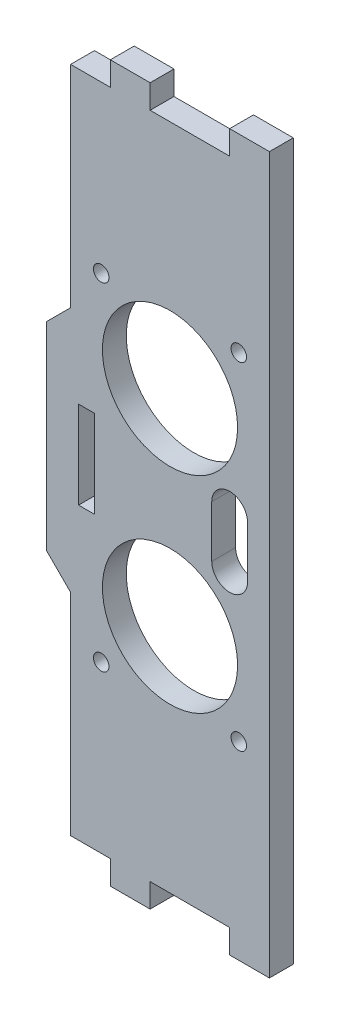
ISO-10303-21;
HEADER;
FILE_DESCRIPTION(('STEP AP214'),'2;1');
FILE_NAME('part.step','',(''),(''),'','','');
FILE_SCHEMA(('AUTOMOTIVE_DESIGN { 1 0 10303 214 1 1 1 1 }'));
ENDSEC;
DATA;
#1=APPLICATION_CONTEXT('core data for automotive mechanical design processes');
#2=APPLICATION_PROTOCOL_DEFINITION('international standard','automotive_design',2000,#1);
#3=PRODUCT_CONTEXT('',#1,'mechanical');
#4=PRODUCT('Part','Part','',(#3));
#5=PRODUCT_RELATED_PRODUCT_CATEGORY('part','',(#4));
#6=PRODUCT_DEFINITION_FORMATION('','',#4);
#7=PRODUCT_DEFINITION_CONTEXT('part definition',#1,'design');
#8=PRODUCT_DEFINITION('design','',#6,#7);
#9=PRODUCT_DEFINITION_SHAPE('','',#8);
#10=(LENGTH_UNIT() NAMED_UNIT(*) SI_UNIT(.MILLI.,.METRE.));
#11=(NAMED_UNIT(*) PLANE_ANGLE_UNIT() SI_UNIT($,.RADIAN.));
#12=(NAMED_UNIT(*) SI_UNIT($,.STERADIAN.) SOLID_ANGLE_UNIT());
#13=UNCERTAINTY_MEASURE_WITH_UNIT(LENGTH_MEASURE(1.E-05),#10,'distance_accuracy_value','');
#14=(GEOMETRIC_REPRESENTATION_CONTEXT(3) GLOBAL_UNCERTAINTY_ASSIGNED_CONTEXT((#13)) GLOBAL_UNIT_ASSIGNED_CONTEXT((#10,
#11,#12)) REPRESENTATION_CONTEXT('',''));
#15=CARTESIAN_POINT('',(0.,0.,0.));
#16=DIRECTION('',(0.,0.,1.));
#17=DIRECTION('',(1.,0.,0.));
#18=AXIS2_PLACEMENT_3D('',#15,#16,#17);
#19=CARTESIAN_POINT('',(-12.5,-45.,3.));
#20=DIRECTION('',(1.,0.,0.));
#21=DIRECTION('',(0.,0.,-1.));
#22=AXIS2_PLACEMENT_3D('',#19,#20,#21);
#23=PLANE('',#22);
#24=DIRECTION('',(0.,-1.,0.));
#25=VECTOR('',#24,1.);
#26=CARTESIAN_POINT('',(-12.5,-45.,0.));
#27=LINE('',#26,#25);
#28=CARTESIAN_POINT('',(-12.5,42.,0.));
#29=VERTEX_POINT('',#28);
#30=CARTESIAN_POINT('',(-12.5,15.5,0.));
#31=VERTEX_POINT('',#30);
#32=EDGE_CURVE('E443',#29,#31,#27,.T.);
#33=ORIENTED_EDGE('',*,*,#32,.T.);
#34=DIRECTION('',(0.,0.,1.));
#35=VECTOR('',#34,1.);
#36=CARTESIAN_POINT('',(-12.5,15.5,3.));
#37=LINE('',#36,#35);
#38=CARTESIAN_POINT('',(-12.5,15.5,3.));
#39=VERTEX_POINT('',#38);
#40=EDGE_CURVE('E57',#31,#39,#37,.T.);
#41=ORIENTED_EDGE('',*,*,#40,.T.);
#42=DIRECTION('',(0.,-1.,0.));
#43=VECTOR('',#42,1.);
#44=CARTESIAN_POINT('',(-12.5,-45.,3.));
#45=LINE('',#44,#43);
#46=CARTESIAN_POINT('',(-12.5,42.,3.));
#47=VERTEX_POINT('',#46);
#48=EDGE_CURVE('E227',#47,#39,#45,.T.);
#49=ORIENTED_EDGE('',*,*,#48,.F.);
#50=DIRECTION('',(0.,0.,-1.));
#51=VECTOR('',#50,1.);
#52=CARTESIAN_POINT('',(-12.5,42.,3.));
#53=LINE('',#52,#51);
#54=EDGE_CURVE('E427',#47,#29,#53,.T.);
#55=ORIENTED_EDGE('',*,*,#54,.T.);
#56=EDGE_LOOP('',(#33,#41,#49,#55));
#57=FACE_BOUND('',#56,.T.);
#58=ADVANCED_FACE('F35',(#57),#23,.F.);
#59=CARTESIAN_POINT('',(0.,0.,3.));
#60=DIRECTION('',(0.,0.,1.));
#61=DIRECTION('',(1.,0.,0.));
#62=AXIS2_PLACEMENT_3D('',#59,#60,#61);
#63=PLANE('',#62);
#64=CARTESIAN_POINT('',(0.,12.95,3.));
#65=DIRECTION('',(0.,0.,1.));
#66=DIRECTION('',(1.,0.,0.));
#67=AXIS2_PLACEMENT_3D('',#64,#65,#66);
#68=CIRCLE('',#67,8.5);
#69=CARTESIAN_POINT('',(8.5,12.95,3.));
#70=VERTEX_POINT('',#69);
#71=EDGE_CURVE('E322',#70,#70,#68,.T.);
#72=ORIENTED_EDGE('',*,*,#71,.F.);
#73=EDGE_LOOP('',(#72));
#74=FACE_BOUND('',#73,.T.);
#75=CARTESIAN_POINT('',(-8.65,-21.175,3.));
#76=DIRECTION('',(0.,0.,1.));
#77=DIRECTION('',(1.,0.,0.));
#78=AXIS2_PLACEMENT_3D('',#75,#76,#77);
#79=CIRCLE('',#78,0.975);
#80=CARTESIAN_POINT('',(-7.675,-21.175,3.));
#81=VERTEX_POINT('',#80);
#82=EDGE_CURVE('E315',#81,#81,#79,.T.);
#83=ORIENTED_EDGE('',*,*,#82,.F.);
#84=EDGE_LOOP('',(#83));
#85=FACE_BOUND('',#84,.T.);
#86=CARTESIAN_POINT('',(8.65,21.175,3.));
#87=DIRECTION('',(0.,0.,1.));
#88=DIRECTION('',(1.,0.,0.));
#89=AXIS2_PLACEMENT_3D('',#86,#87,#88);
#90=CIRCLE('',#89,0.975);
#91=CARTESIAN_POINT('',(9.625,21.175,3.));
#92=VERTEX_POINT('',#91);
#93=EDGE_CURVE('E334',#92,#92,#90,.T.);
#94=ORIENTED_EDGE('',*,*,#93,.F.);
#95=EDGE_LOOP('',(#94));
#96=FACE_BOUND('',#95,.T.);
#97=CARTESIAN_POINT('',(-8.65,21.175,3.));
#98=DIRECTION('',(0.,0.,1.));
#99=DIRECTION('',(1.,0.,0.));
#100=AXIS2_PLACEMENT_3D('',#97,#98,#99);
#101=CIRCLE('',#100,0.975);
#102=CARTESIAN_POINT('',(-7.675,21.175,3.));
#103=VERTEX_POINT('',#102);
#104=EDGE_CURVE('E327',#103,#103,#101,.T.);
#105=ORIENTED_EDGE('',*,*,#104,.F.);
#106=EDGE_LOOP('',(#105));
#107=FACE_BOUND('',#106,.T.);
#108=CARTESIAN_POINT('',(8.65,-21.175,3.));
#109=DIRECTION('',(0.,0.,1.));
#110=DIRECTION('',(1.,0.,0.));
#111=AXIS2_PLACEMENT_3D('',#108,#109,#110);
#112=CIRCLE('',#111,0.975);
#113=CARTESIAN_POINT('',(9.625,-21.175,3.));
#114=VERTEX_POINT('',#113);
#115=EDGE_CURVE('E278',#114,#114,#112,.T.);
#116=ORIENTED_EDGE('',*,*,#115,.F.);
#117=EDGE_LOOP('',(#116));
#118=FACE_BOUND('',#117,.T.);
#119=DIRECTION('',(0.,1.,0.));
#120=VECTOR('',#119,1.);
#121=CARTESIAN_POINT('',(9.75,-3.25,3.));
#122=LINE('',#121,#120);
#123=CARTESIAN_POINT('',(9.75,-3.25,3.));
#124=VERTEX_POINT('',#123);
#125=CARTESIAN_POINT('',(9.75,3.25,3.));
#126=VERTEX_POINT('',#125);
#127=EDGE_CURVE('E288',#124,#126,#122,.T.);
#128=ORIENTED_EDGE('',*,*,#127,.F.);
#129=CARTESIAN_POINT('',(7.5,-3.25,3.));
#130=DIRECTION('',(0.,0.,1.));
#131=DIRECTION('',(1.,0.,0.));
#132=AXIS2_PLACEMENT_3D('',#129,#130,#131);
#133=CIRCLE('',#132,2.25);
#134=CARTESIAN_POINT('',(5.25,-3.25,3.));
#135=VERTEX_POINT('',#134);
#136=EDGE_CURVE('E286',#135,#124,#133,.T.);
#137=ORIENTED_EDGE('',*,*,#136,.F.);
#138=DIRECTION('',(0.,-1.,0.));
#139=VECTOR('',#138,1.);
#140=CARTESIAN_POINT('',(5.25,3.25,3.));
#141=LINE('',#140,#139);
#142=CARTESIAN_POINT('',(5.25,3.25,3.));
#143=VERTEX_POINT('',#142);
#144=EDGE_CURVE('E294',#143,#135,#141,.T.);
#145=ORIENTED_EDGE('',*,*,#144,.F.);
#146=CARTESIAN_POINT('',(7.5,3.25,3.));
#147=DIRECTION('',(0.,0.,1.));
#148=DIRECTION('',(1.,0.,0.));
#149=AXIS2_PLACEMENT_3D('',#146,#147,#148);
#150=CIRCLE('',#149,2.25);
#151=EDGE_CURVE('E291',#126,#143,#150,.T.);
#152=ORIENTED_EDGE('',*,*,#151,.F.);
#153=EDGE_LOOP('',(#128,#137,#145,#152));
#154=FACE_BOUND('',#153,.T.);
#155=CARTESIAN_POINT('',(0.,-12.95,3.));
#156=DIRECTION('',(0.,0.,1.));
#157=DIRECTION('',(1.,0.,0.));
#158=AXIS2_PLACEMENT_3D('',#155,#156,#157);
#159=CIRCLE('',#158,8.5);
#160=CARTESIAN_POINT('',(8.50000000000001,-12.95,3.));
#161=VERTEX_POINT('',#160);
#162=EDGE_CURVE('E339',#161,#161,#159,.T.);
#163=ORIENTED_EDGE('',*,*,#162,.F.);
#164=EDGE_LOOP('',(#163));
#165=FACE_BOUND('',#164,.T.);
#166=DIRECTION('',(0.,-1.,0.));
#167=VECTOR('',#166,1.);
#168=CARTESIAN_POINT('',(7.5,-45.,3.));
#169=LINE('',#168,#167);
#170=CARTESIAN_POINT('',(7.5,-42.,3.));
#171=VERTEX_POINT('',#170);
#172=CARTESIAN_POINT('',(7.5,-45.,3.));
#173=VERTEX_POINT('',#172);
#174=EDGE_CURVE('E345',#171,#173,#169,.T.);
#175=ORIENTED_EDGE('',*,*,#174,.T.);
#176=DIRECTION('',(1.,0.,0.));
#177=VECTOR('',#176,1.);
#178=CARTESIAN_POINT('',(12.5,-45.,3.));
#179=LINE('',#178,#177);
#180=CARTESIAN_POINT('',(12.5,-45.,3.));
#181=VERTEX_POINT('',#180);
#182=EDGE_CURVE('E432',#173,#181,#179,.T.);
#183=ORIENTED_EDGE('',*,*,#182,.T.);
#184=DIRECTION('',(0.,1.,0.));
#185=VECTOR('',#184,1.);
#186=CARTESIAN_POINT('',(12.5,-45.,3.));
#187=LINE('',#186,#185);
#188=CARTESIAN_POINT('',(12.5,45.,3.));
#189=VERTEX_POINT('',#188);
#190=EDGE_CURVE('E436',#181,#189,#187,.T.);
#191=ORIENTED_EDGE('',*,*,#190,.T.);
#192=DIRECTION('',(-1.,0.,0.));
#193=VECTOR('',#192,1.);
#194=CARTESIAN_POINT('',(12.5,45.,3.));
#195=LINE('',#194,#193);
#196=CARTESIAN_POINT('',(7.5,45.,3.));
#197=VERTEX_POINT('',#196);
#198=EDGE_CURVE('E439',#189,#197,#195,.T.);
#199=ORIENTED_EDGE('',*,*,#198,.T.);
#200=DIRECTION('',(0.,1.,0.));
#201=VECTOR('',#200,1.);
#202=CARTESIAN_POINT('',(7.5,45.,3.));
#203=LINE('',#202,#201);
#204=CARTESIAN_POINT('',(7.5,42.,3.));
#205=VERTEX_POINT('',#204);
#206=EDGE_CURVE('E394',#205,#197,#203,.T.);
#207=ORIENTED_EDGE('',*,*,#206,.F.);
#208=DIRECTION('',(1.,0.,0.));
#209=VECTOR('',#208,1.);
#210=CARTESIAN_POINT('',(-2.5,42.,3.));
#211=LINE('',#210,#209);
#212=CARTESIAN_POINT('',(-2.5,42.,3.));
#213=VERTEX_POINT('',#212);
#214=EDGE_CURVE('E391',#213,#205,#211,.T.);
#215=ORIENTED_EDGE('',*,*,#214,.F.);
#216=DIRECTION('',(0.,-1.,0.));
#217=VECTOR('',#216,1.);
#218=CARTESIAN_POINT('',(-2.5,45.,3.));
#219=LINE('',#218,#217);
#220=CARTESIAN_POINT('',(-2.5,45.,3.));
#221=VERTEX_POINT('',#220);
#222=EDGE_CURVE('E389',#221,#213,#219,.T.);
#223=ORIENTED_EDGE('',*,*,#222,.F.);
#224=CARTESIAN_POINT('',(-7.5,45.,3.));
#225=VERTEX_POINT('',#224);
#226=EDGE_CURVE('E438',#221,#225,#195,.T.);
#227=ORIENTED_EDGE('',*,*,#226,.T.);
#228=DIRECTION('',(0.,1.,0.));
#229=VECTOR('',#228,1.);
#230=CARTESIAN_POINT('',(-7.5,45.,3.));
#231=LINE('',#230,#229);
#232=CARTESIAN_POINT('',(-7.5,42.,3.));
#233=VERTEX_POINT('',#232);
#234=EDGE_CURVE('E415',#233,#225,#231,.T.);
#235=ORIENTED_EDGE('',*,*,#234,.F.);
#236=DIRECTION('',(1.,0.,0.));
#237=VECTOR('',#236,1.);
#238=CARTESIAN_POINT('',(-12.5,42.,3.));
#239=LINE('',#238,#237);
#240=EDGE_CURVE('E417',#47,#233,#239,.T.);
#241=ORIENTED_EDGE('',*,*,#240,.F.);
#242=ORIENTED_EDGE('',*,*,#48,.T.);
#243=DIRECTION('',(0.707106781186551,0.707106781186544,0.));
#244=VECTOR('',#243,1.);
#245=CARTESIAN_POINT('',(-15.5,12.5,3.));
#246=LINE('',#245,#244);
#247=CARTESIAN_POINT('',(-15.5,12.5,3.));
#248=VERTEX_POINT('',#247);
#249=EDGE_CURVE('E11',#39,#248,#246,.F.);
#250=ORIENTED_EDGE('',*,*,#249,.T.);
#251=DIRECTION('',(0.,-1.,0.));
#252=VECTOR('',#251,1.);
#253=CARTESIAN_POINT('',(-15.5,12.5,3.));
#254=LINE('',#253,#252);
#255=CARTESIAN_POINT('',(-15.5,-12.5,3.));
#256=VERTEX_POINT('',#255);
#257=EDGE_CURVE('E224',#248,#256,#254,.T.);
#258=ORIENTED_EDGE('',*,*,#257,.T.);
#259=DIRECTION('',(-0.707106781186546,0.707106781186549,0.));
#260=VECTOR('',#259,1.);
#261=CARTESIAN_POINT('',(-12.5,-15.5,3.));
#262=LINE('',#261,#260);
#263=CARTESIAN_POINT('',(-12.5,-15.5,3.));
#264=VERTEX_POINT('',#263);
#265=EDGE_CURVE('E465',#256,#264,#262,.F.);
#266=ORIENTED_EDGE('',*,*,#265,.T.);
#267=CARTESIAN_POINT('',(-12.5,-42.,3.));
#268=VERTEX_POINT('',#267);
#269=EDGE_CURVE('E433',#264,#268,#45,.T.);
#270=ORIENTED_EDGE('',*,*,#269,.T.);
#271=DIRECTION('',(1.,0.,0.));
#272=VECTOR('',#271,1.);
#273=CARTESIAN_POINT('',(-12.5,-42.,3.));
#274=LINE('',#273,#272);
#275=CARTESIAN_POINT('',(-7.5,-42.,3.));
#276=VERTEX_POINT('',#275);
#277=EDGE_CURVE('E375',#268,#276,#274,.T.);
#278=ORIENTED_EDGE('',*,*,#277,.T.);
#279=DIRECTION('',(0.,-1.,0.));
#280=VECTOR('',#279,1.);
#281=CARTESIAN_POINT('',(-7.5,-45.,3.));
#282=LINE('',#281,#280);
#283=CARTESIAN_POINT('',(-7.5,-45.,3.));
#284=VERTEX_POINT('',#283);
#285=EDGE_CURVE('E372',#276,#284,#282,.T.);
#286=ORIENTED_EDGE('',*,*,#285,.T.);
#287=CARTESIAN_POINT('',(-2.5,-45.,3.));
#288=VERTEX_POINT('',#287);
#289=EDGE_CURVE('E435',#284,#288,#179,.T.);
#290=ORIENTED_EDGE('',*,*,#289,.T.);
#291=DIRECTION('',(0.,1.,0.));
#292=VECTOR('',#291,1.);
#293=CARTESIAN_POINT('',(-2.5,-45.,3.));
#294=LINE('',#293,#292);
#295=CARTESIAN_POINT('',(-2.5,-42.,3.));
#296=VERTEX_POINT('',#295);
#297=EDGE_CURVE('E351',#288,#296,#294,.T.);
#298=ORIENTED_EDGE('',*,*,#297,.T.);
#299=DIRECTION('',(1.,0.,0.));
#300=VECTOR('',#299,1.);
#301=CARTESIAN_POINT('',(-2.5,-42.,3.));
#302=LINE('',#301,#300);
#303=EDGE_CURVE('E347',#296,#171,#302,.T.);
#304=ORIENTED_EDGE('',*,*,#303,.T.);
#305=EDGE_LOOP('',(#175,#183,#191,#199,#207,#215,#223,#227,#235,#241,#242,#250,#258,#266,#270,
#278,#286,#290,#298,#304));
#306=FACE_BOUND('',#305,.T.);
#307=DIRECTION('',(1.,0.,0.));
#308=VECTOR('',#307,1.);
#309=CARTESIAN_POINT('',(0.,5.50000000000001,3.));
#310=LINE('',#309,#308);
#311=CARTESIAN_POINT('',(-11.5,5.50000000000001,3.));
#312=VERTEX_POINT('',#311);
#313=CARTESIAN_POINT('',(-9.5,5.50000000000001,3.));
#314=VERTEX_POINT('',#313);
#315=EDGE_CURVE('E271',#312,#314,#310,.T.);
#316=ORIENTED_EDGE('',*,*,#315,.T.);
#317=DIRECTION('',(0.,-1.,0.));
#318=VECTOR('',#317,1.);
#319=CARTESIAN_POINT('',(-9.5,0.,3.));
#320=LINE('',#319,#318);
#321=CARTESIAN_POINT('',(-9.5,-5.49999999999999,3.));
#322=VERTEX_POINT('',#321);
#323=EDGE_CURVE('E274',#314,#322,#320,.T.);
#324=ORIENTED_EDGE('',*,*,#323,.T.);
#325=DIRECTION('',(-1.,0.,0.));
#326=VECTOR('',#325,1.);
#327=CARTESIAN_POINT('',(0.,-5.49999999999999,3.));
#328=LINE('',#327,#326);
#329=CARTESIAN_POINT('',(-11.5,-5.49999999999999,3.));
#330=VERTEX_POINT('',#329);
#331=EDGE_CURVE('E265',#322,#330,#328,.T.);
#332=ORIENTED_EDGE('',*,*,#331,.T.);
#333=DIRECTION('',(0.,1.,0.));
#334=VECTOR('',#333,1.);
#335=CARTESIAN_POINT('',(-11.5,0.,3.));
#336=LINE('',#335,#334);
#337=EDGE_CURVE('E268',#330,#312,#336,.T.);
#338=ORIENTED_EDGE('',*,*,#337,.T.);
#339=EDGE_LOOP('',(#316,#324,#332,#338));
#340=FACE_BOUND('',#339,.T.);
#341=ADVANCED_FACE('F222',(#74,#85,#96,#107,#118,#154,#165,#306,#340),#63,.T.);
#342=CARTESIAN_POINT('',(0.,0.,0.));
#343=DIRECTION('',(0.,0.,1.));
#344=DIRECTION('',(1.,0.,0.));
#345=AXIS2_PLACEMENT_3D('',#342,#343,#344);
#346=PLANE('',#345);
#347=DIRECTION('',(1.,0.,0.));
#348=VECTOR('',#347,1.);
#349=CARTESIAN_POINT('',(12.5,-45.,0.));
#350=LINE('',#349,#348);
#351=CARTESIAN_POINT('',(7.5,-45.,0.));
#352=VERTEX_POINT('',#351);
#353=CARTESIAN_POINT('',(12.5,-45.,0.));
#354=VERTEX_POINT('',#353);
#355=EDGE_CURVE('E445',#352,#354,#350,.T.);
#356=ORIENTED_EDGE('',*,*,#355,.F.);
#357=DIRECTION('',(0.,-1.,0.));
#358=VECTOR('',#357,1.);
#359=CARTESIAN_POINT('',(7.5,-45.,0.));
#360=LINE('',#359,#358);
#361=CARTESIAN_POINT('',(7.5,-42.,0.));
#362=VERTEX_POINT('',#361);
#363=EDGE_CURVE('E355',#362,#352,#360,.T.);
#364=ORIENTED_EDGE('',*,*,#363,.F.);
#365=DIRECTION('',(1.,0.,0.));
#366=VECTOR('',#365,1.);
#367=CARTESIAN_POINT('',(-2.5,-42.,0.));
#368=LINE('',#367,#366);
#369=CARTESIAN_POINT('',(-2.5,-42.,0.));
#370=VERTEX_POINT('',#369);
#371=EDGE_CURVE('E357',#370,#362,#368,.T.);
#372=ORIENTED_EDGE('',*,*,#371,.F.);
#373=DIRECTION('',(0.,1.,0.));
#374=VECTOR('',#373,1.);
#375=CARTESIAN_POINT('',(-2.5,-45.,0.));
#376=LINE('',#375,#374);
#377=CARTESIAN_POINT('',(-2.5,-45.,0.));
#378=VERTEX_POINT('',#377);
#379=EDGE_CURVE('E348',#378,#370,#376,.T.);
#380=ORIENTED_EDGE('',*,*,#379,.F.);
#381=CARTESIAN_POINT('',(-7.5,-45.,0.));
#382=VERTEX_POINT('',#381);
#383=EDGE_CURVE('E447',#382,#378,#350,.T.);
#384=ORIENTED_EDGE('',*,*,#383,.F.);
#385=DIRECTION('',(0.,-1.,0.));
#386=VECTOR('',#385,1.);
#387=CARTESIAN_POINT('',(-7.5,-45.,0.));
#388=LINE('',#387,#386);
#389=CARTESIAN_POINT('',(-7.5,-42.,0.));
#390=VERTEX_POINT('',#389);
#391=EDGE_CURVE('E342',#390,#382,#388,.T.);
#392=ORIENTED_EDGE('',*,*,#391,.F.);
#393=DIRECTION('',(1.,0.,0.));
#394=VECTOR('',#393,1.);
#395=CARTESIAN_POINT('',(-12.5,-42.,0.));
#396=LINE('',#395,#394);
#397=CARTESIAN_POINT('',(-12.5,-42.,0.));
#398=VERTEX_POINT('',#397);
#399=EDGE_CURVE('E376',#398,#390,#396,.T.);
#400=ORIENTED_EDGE('',*,*,#399,.F.);
#401=CARTESIAN_POINT('',(-12.5,-15.5,0.));
#402=VERTEX_POINT('',#401);
#403=EDGE_CURVE('E414',#402,#398,#27,.T.);
#404=ORIENTED_EDGE('',*,*,#403,.F.);
#405=DIRECTION('',(0.707106781186546,-0.707106781186549,0.));
#406=VECTOR('',#405,1.);
#407=CARTESIAN_POINT('',(-14.,-14.,0.));
#408=LINE('',#407,#406);
#409=CARTESIAN_POINT('',(-15.5,-12.5,0.));
#410=VERTEX_POINT('',#409);
#411=EDGE_CURVE('E463',#402,#410,#408,.F.);
#412=ORIENTED_EDGE('',*,*,#411,.T.);
#413=DIRECTION('',(0.,-1.,0.));
#414=VECTOR('',#413,1.);
#415=CARTESIAN_POINT('',(-15.5,12.5,0.));
#416=LINE('',#415,#414);
#417=CARTESIAN_POINT('',(-15.5,12.5,0.));
#418=VERTEX_POINT('',#417);
#419=EDGE_CURVE('E238',#418,#410,#416,.T.);
#420=ORIENTED_EDGE('',*,*,#419,.F.);
#421=DIRECTION('',(-0.707106781186551,-0.707106781186544,0.));
#422=VECTOR('',#421,1.);
#423=CARTESIAN_POINT('',(-13.9999999999999,14.0000000000001,0.));
#424=LINE('',#423,#422);
#425=EDGE_CURVE('E44',#418,#31,#424,.F.);
#426=ORIENTED_EDGE('',*,*,#425,.T.);
#427=ORIENTED_EDGE('',*,*,#32,.F.);
#428=DIRECTION('',(1.,0.,0.));
#429=VECTOR('',#428,1.);
#430=CARTESIAN_POINT('',(-12.5,42.,0.));
#431=LINE('',#430,#429);
#432=CARTESIAN_POINT('',(-7.5,42.,0.));
#433=VERTEX_POINT('',#432);
#434=EDGE_CURVE('E418',#29,#433,#431,.T.);
#435=ORIENTED_EDGE('',*,*,#434,.T.);
#436=DIRECTION('',(0.,1.,0.));
#437=VECTOR('',#436,1.);
#438=CARTESIAN_POINT('',(-7.5,45.,0.));
#439=LINE('',#438,#437);
#440=CARTESIAN_POINT('',(-7.5,45.,0.));
#441=VERTEX_POINT('',#440);
#442=EDGE_CURVE('E371',#433,#441,#439,.T.);
#443=ORIENTED_EDGE('',*,*,#442,.T.);
#444=DIRECTION('',(-1.,0.,0.));
#445=VECTOR('',#444,1.);
#446=CARTESIAN_POINT('',(12.5,45.,0.));
#447=LINE('',#446,#445);
#448=CARTESIAN_POINT('',(-2.5,45.,0.));
#449=VERTEX_POINT('',#448);
#450=EDGE_CURVE('E450',#449,#441,#447,.T.);
#451=ORIENTED_EDGE('',*,*,#450,.F.);
#452=DIRECTION('',(0.,-1.,0.));
#453=VECTOR('',#452,1.);
#454=CARTESIAN_POINT('',(-2.5,45.,0.));
#455=LINE('',#454,#453);
#456=CARTESIAN_POINT('',(-2.5,42.,0.));
#457=VERTEX_POINT('',#456);
#458=EDGE_CURVE('E397',#449,#457,#455,.T.);
#459=ORIENTED_EDGE('',*,*,#458,.T.);
#460=DIRECTION('',(1.,0.,0.));
#461=VECTOR('',#460,1.);
#462=CARTESIAN_POINT('',(-2.5,42.,0.));
#463=LINE('',#462,#461);
#464=CARTESIAN_POINT('',(7.5,42.,0.));
#465=VERTEX_POINT('',#464);
#466=EDGE_CURVE('E400',#457,#465,#463,.T.);
#467=ORIENTED_EDGE('',*,*,#466,.T.);
#468=DIRECTION('',(0.,1.,0.));
#469=VECTOR('',#468,1.);
#470=CARTESIAN_POINT('',(7.5,45.,0.));
#471=LINE('',#470,#469);
#472=CARTESIAN_POINT('',(7.5,45.,0.));
#473=VERTEX_POINT('',#472);
#474=EDGE_CURVE('E392',#465,#473,#471,.T.);
#475=ORIENTED_EDGE('',*,*,#474,.T.);
#476=CARTESIAN_POINT('',(12.5,45.,0.));
#477=VERTEX_POINT('',#476);
#478=EDGE_CURVE('E451',#477,#473,#447,.T.);
#479=ORIENTED_EDGE('',*,*,#478,.F.);
#480=DIRECTION('',(0.,1.,0.));
#481=VECTOR('',#480,1.);
#482=CARTESIAN_POINT('',(12.5,-45.,0.));
#483=LINE('',#482,#481);
#484=EDGE_CURVE('E448',#354,#477,#483,.T.);
#485=ORIENTED_EDGE('',*,*,#484,.F.);
#486=EDGE_LOOP('',(#356,#364,#372,#380,#384,#392,#400,#404,#412,#420,#426,#427,#435,#443,#451,
#459,#467,#475,#479,#485));
#487=FACE_BOUND('',#486,.T.);
#488=CARTESIAN_POINT('',(0.,-12.95,0.));
#489=DIRECTION('',(0.,0.,1.));
#490=DIRECTION('',(1.,0.,0.));
#491=AXIS2_PLACEMENT_3D('',#488,#489,#490);
#492=CIRCLE('',#491,8.5);
#493=CARTESIAN_POINT('',(8.50000000000001,-12.95,0.));
#494=VERTEX_POINT('',#493);
#495=EDGE_CURVE('E330',#494,#494,#492,.T.);
#496=ORIENTED_EDGE('',*,*,#495,.T.);
#497=EDGE_LOOP('',(#496));
#498=FACE_BOUND('',#497,.T.);
#499=CARTESIAN_POINT('',(7.5,-3.25,0.));
#500=DIRECTION('',(0.,0.,1.));
#501=DIRECTION('',(1.,0.,0.));
#502=AXIS2_PLACEMENT_3D('',#499,#500,#501);
#503=CIRCLE('',#502,2.25);
#504=CARTESIAN_POINT('',(5.25,-3.25,0.));
#505=VERTEX_POINT('',#504);
#506=CARTESIAN_POINT('',(9.75,-3.25,0.));
#507=VERTEX_POINT('',#506);
#508=EDGE_CURVE('E277',#505,#507,#503,.T.);
#509=ORIENTED_EDGE('',*,*,#508,.T.);
#510=DIRECTION('',(0.,1.,0.));
#511=VECTOR('',#510,1.);
#512=CARTESIAN_POINT('',(9.75,-3.25,0.));
#513=LINE('',#512,#511);
#514=CARTESIAN_POINT('',(9.75,3.25,0.));
#515=VERTEX_POINT('',#514);
#516=EDGE_CURVE('E299',#507,#515,#513,.T.);
#517=ORIENTED_EDGE('',*,*,#516,.T.);
#518=CARTESIAN_POINT('',(7.5,3.25,0.));
#519=DIRECTION('',(0.,0.,1.));
#520=DIRECTION('',(1.,0.,0.));
#521=AXIS2_PLACEMENT_3D('',#518,#519,#520);
#522=CIRCLE('',#521,2.25);
#523=CARTESIAN_POINT('',(5.25,3.25,0.));
#524=VERTEX_POINT('',#523);
#525=EDGE_CURVE('E302',#515,#524,#522,.T.);
#526=ORIENTED_EDGE('',*,*,#525,.T.);
#527=DIRECTION('',(0.,-1.,0.));
#528=VECTOR('',#527,1.);
#529=CARTESIAN_POINT('',(5.25,3.25,0.));
#530=LINE('',#529,#528);
#531=EDGE_CURVE('E289',#524,#505,#530,.T.);
#532=ORIENTED_EDGE('',*,*,#531,.T.);
#533=EDGE_LOOP('',(#509,#517,#526,#532));
#534=FACE_BOUND('',#533,.T.);
#535=CARTESIAN_POINT('',(8.65,-21.175,0.));
#536=DIRECTION('',(0.,0.,1.));
#537=DIRECTION('',(1.,0.,0.));
#538=AXIS2_PLACEMENT_3D('',#535,#536,#537);
#539=CIRCLE('',#538,0.975);
#540=CARTESIAN_POINT('',(9.625,-21.175,0.));
#541=VERTEX_POINT('',#540);
#542=EDGE_CURVE('E282',#541,#541,#539,.T.);
#543=ORIENTED_EDGE('',*,*,#542,.T.);
#544=EDGE_LOOP('',(#543));
#545=FACE_BOUND('',#544,.T.);
#546=CARTESIAN_POINT('',(-8.65,21.175,0.));
#547=DIRECTION('',(0.,0.,1.));
#548=DIRECTION('',(1.,0.,0.));
#549=AXIS2_PLACEMENT_3D('',#546,#547,#548);
#550=CIRCLE('',#549,0.975);
#551=CARTESIAN_POINT('',(-7.675,21.175,0.));
#552=VERTEX_POINT('',#551);
#553=EDGE_CURVE('E331',#552,#552,#550,.T.);
#554=ORIENTED_EDGE('',*,*,#553,.T.);
#555=EDGE_LOOP('',(#554));
#556=FACE_BOUND('',#555,.T.);
#557=CARTESIAN_POINT('',(8.65,21.175,0.));
#558=DIRECTION('',(0.,0.,1.));
#559=DIRECTION('',(1.,0.,0.));
#560=AXIS2_PLACEMENT_3D('',#557,#558,#559);
#561=CIRCLE('',#560,0.975);
#562=CARTESIAN_POINT('',(9.625,21.175,0.));
#563=VERTEX_POINT('',#562);
#564=EDGE_CURVE('E318',#563,#563,#561,.T.);
#565=ORIENTED_EDGE('',*,*,#564,.T.);
#566=EDGE_LOOP('',(#565));
#567=FACE_BOUND('',#566,.T.);
#568=CARTESIAN_POINT('',(-8.65,-21.175,0.));
#569=DIRECTION('',(0.,0.,1.));
#570=DIRECTION('',(1.,0.,0.));
#571=AXIS2_PLACEMENT_3D('',#568,#569,#570);
#572=CIRCLE('',#571,0.975);
#573=CARTESIAN_POINT('',(-7.675,-21.175,0.));
#574=VERTEX_POINT('',#573);
#575=EDGE_CURVE('E319',#574,#574,#572,.T.);
#576=ORIENTED_EDGE('',*,*,#575,.T.);
#577=EDGE_LOOP('',(#576));
#578=FACE_BOUND('',#577,.T.);
#579=CARTESIAN_POINT('',(0.,12.95,0.));
#580=DIRECTION('',(0.,0.,1.));
#581=DIRECTION('',(1.,0.,0.));
#582=AXIS2_PLACEMENT_3D('',#579,#580,#581);
#583=CIRCLE('',#582,8.5);
#584=CARTESIAN_POINT('',(8.5,12.95,0.));
#585=VERTEX_POINT('',#584);
#586=EDGE_CURVE('E281',#585,#585,#583,.T.);
#587=ORIENTED_EDGE('',*,*,#586,.T.);
#588=EDGE_LOOP('',(#587));
#589=FACE_BOUND('',#588,.T.);
#590=DIRECTION('',(0.,1.,0.));
#591=VECTOR('',#590,1.);
#592=CARTESIAN_POINT('',(-9.5,-5.49999999999999,0.));
#593=LINE('',#592,#591);
#594=CARTESIAN_POINT('',(-9.5,-5.49999999999999,0.));
#595=VERTEX_POINT('',#594);
#596=CARTESIAN_POINT('',(-9.5,5.50000000000001,0.));
#597=VERTEX_POINT('',#596);
#598=EDGE_CURVE('E240',#595,#597,#593,.T.);
#599=ORIENTED_EDGE('',*,*,#598,.T.);
#600=DIRECTION('',(-1.,0.,0.));
#601=VECTOR('',#600,1.);
#602=CARTESIAN_POINT('',(-11.5,5.50000000000001,0.));
#603=LINE('',#602,#601);
#604=CARTESIAN_POINT('',(-11.5,5.50000000000001,0.));
#605=VERTEX_POINT('',#604);
#606=EDGE_CURVE('E243',#597,#605,#603,.T.);
#607=ORIENTED_EDGE('',*,*,#606,.T.);
#608=DIRECTION('',(0.,-1.,0.));
#609=VECTOR('',#608,1.);
#610=CARTESIAN_POINT('',(-11.5,-5.49999999999999,0.));
#611=LINE('',#610,#609);
#612=CARTESIAN_POINT('',(-11.5,-5.49999999999999,0.));
#613=VERTEX_POINT('',#612);
#614=EDGE_CURVE('E250',#605,#613,#611,.T.);
#615=ORIENTED_EDGE('',*,*,#614,.T.);
#616=DIRECTION('',(1.,0.,0.));
#617=VECTOR('',#616,1.);
#618=CARTESIAN_POINT('',(-11.5,-5.49999999999999,0.));
#619=LINE('',#618,#617);
#620=EDGE_CURVE('E253',#613,#595,#619,.T.);
#621=ORIENTED_EDGE('',*,*,#620,.T.);
#622=EDGE_LOOP('',(#599,#607,#615,#621));
#623=FACE_BOUND('',#622,.T.);
#624=ADVANCED_FACE('F476',(#487,#498,#534,#545,#556,#567,#578,#589,#623),#346,.F.);
#625=CARTESIAN_POINT('',(12.5,-45.,3.));
#626=DIRECTION('',(0.,1.,0.));
#627=DIRECTION('',(0.,0.,1.));
#628=AXIS2_PLACEMENT_3D('',#625,#626,#627);
#629=PLANE('',#628);
#630=ORIENTED_EDGE('',*,*,#182,.F.);
#631=DIRECTION('',(0.,0.,-1.));
#632=VECTOR('',#631,1.);
#633=CARTESIAN_POINT('',(7.5,-45.,3.));
#634=LINE('',#633,#632);
#635=EDGE_CURVE('E368',#173,#352,#634,.T.);
#636=ORIENTED_EDGE('',*,*,#635,.T.);
#637=ORIENTED_EDGE('',*,*,#355,.T.);
#638=DIRECTION('',(0.,0.,-1.));
#639=VECTOR('',#638,1.);
#640=CARTESIAN_POINT('',(12.5,-45.,3.));
#641=LINE('',#640,#639);
#642=EDGE_CURVE('E456',#181,#354,#641,.T.);
#643=ORIENTED_EDGE('',*,*,#642,.F.);
#644=EDGE_LOOP('',(#630,#636,#637,#643));
#645=FACE_BOUND('',#644,.T.);
#646=ADVANCED_FACE('F504',(#645),#629,.F.);
#647=ORIENTED_EDGE('',*,*,#269,.F.);
#648=DIRECTION('',(0.,0.,-1.));
#649=VECTOR('',#648,1.);
#650=CARTESIAN_POINT('',(-12.5,-15.5,0.));
#651=LINE('',#650,#649);
#652=EDGE_CURVE('E459',#264,#402,#651,.T.);
#653=ORIENTED_EDGE('',*,*,#652,.T.);
#654=ORIENTED_EDGE('',*,*,#403,.T.);
#655=DIRECTION('',(0.,0.,-1.));
#656=VECTOR('',#655,1.);
#657=CARTESIAN_POINT('',(-12.5,-42.,3.));
#658=LINE('',#657,#656);
#659=EDGE_CURVE('E385',#268,#398,#658,.T.);
#660=ORIENTED_EDGE('',*,*,#659,.F.);
#661=EDGE_LOOP('',(#647,#653,#654,#660));
#662=FACE_BOUND('',#661,.T.);
#663=ADVANCED_FACE('F472',(#662),#23,.F.);
#664=CARTESIAN_POINT('',(12.5,45.,3.));
#665=DIRECTION('',(0.,-1.,0.));
#666=DIRECTION('',(0.,0.,-1.));
#667=AXIS2_PLACEMENT_3D('',#664,#665,#666);
#668=PLANE('',#667);
#669=DIRECTION('',(0.,0.,-1.));
#670=VECTOR('',#669,1.);
#671=CARTESIAN_POINT('',(-2.5,45.,3.));
#672=LINE('',#671,#670);
#673=EDGE_CURVE('E411',#221,#449,#672,.T.);
#674=ORIENTED_EDGE('',*,*,#673,.T.);
#675=ORIENTED_EDGE('',*,*,#450,.T.);
#676=DIRECTION('',(0.,0.,-1.));
#677=VECTOR('',#676,1.);
#678=CARTESIAN_POINT('',(-7.5,45.,3.));
#679=LINE('',#678,#677);
#680=EDGE_CURVE('E401',#225,#441,#679,.T.);
#681=ORIENTED_EDGE('',*,*,#680,.F.);
#682=ORIENTED_EDGE('',*,*,#226,.F.);
#683=EDGE_LOOP('',(#674,#675,#681,#682));
#684=FACE_BOUND('',#683,.T.);
#685=ADVANCED_FACE('F533',(#684),#668,.F.);
#686=DIRECTION('',(0.,0.,-1.));
#687=VECTOR('',#686,1.);
#688=CARTESIAN_POINT('',(7.5,45.,3.));
#689=LINE('',#688,#687);
#690=EDGE_CURVE('E396',#197,#473,#689,.T.);
#691=ORIENTED_EDGE('',*,*,#690,.F.);
#692=ORIENTED_EDGE('',*,*,#198,.F.);
#693=DIRECTION('',(0.,0.,-1.));
#694=VECTOR('',#693,1.);
#695=CARTESIAN_POINT('',(12.5,45.,3.));
#696=LINE('',#695,#694);
#697=EDGE_CURVE('E442',#189,#477,#696,.T.);
#698=ORIENTED_EDGE('',*,*,#697,.T.);
#699=ORIENTED_EDGE('',*,*,#478,.T.);
#700=EDGE_LOOP('',(#691,#692,#698,#699));
#701=FACE_BOUND('',#700,.T.);
#702=ADVANCED_FACE('F515',(#701),#668,.F.);
#703=ORIENTED_EDGE('',*,*,#383,.T.);
#704=DIRECTION('',(0.,0.,-1.));
#705=VECTOR('',#704,1.);
#706=CARTESIAN_POINT('',(-2.5,-45.,3.));
#707=LINE('',#706,#705);
#708=EDGE_CURVE('E354',#288,#378,#707,.T.);
#709=ORIENTED_EDGE('',*,*,#708,.F.);
#710=ORIENTED_EDGE('',*,*,#289,.F.);
#711=DIRECTION('',(0.,0.,-1.));
#712=VECTOR('',#711,1.);
#713=CARTESIAN_POINT('',(-7.5,-45.,3.));
#714=LINE('',#713,#712);
#715=EDGE_CURVE('E379',#284,#382,#714,.T.);
#716=ORIENTED_EDGE('',*,*,#715,.T.);
#717=EDGE_LOOP('',(#703,#709,#710,#716));
#718=FACE_BOUND('',#717,.T.);
#719=ADVANCED_FACE('F489',(#718),#629,.F.);
#720=CARTESIAN_POINT('',(12.5,-45.,3.));
#721=DIRECTION('',(-1.,0.,0.));
#722=DIRECTION('',(0.,0.,1.));
#723=AXIS2_PLACEMENT_3D('',#720,#721,#722);
#724=PLANE('',#723);
#725=ORIENTED_EDGE('',*,*,#484,.T.);
#726=ORIENTED_EDGE('',*,*,#697,.F.);
#727=ORIENTED_EDGE('',*,*,#190,.F.);
#728=ORIENTED_EDGE('',*,*,#642,.T.);
#729=EDGE_LOOP('',(#725,#726,#727,#728));
#730=FACE_BOUND('',#729,.T.);
#731=ADVANCED_FACE('F509',(#730),#724,.F.);
#732=CARTESIAN_POINT('',(-7.5,45.,3.));
#733=DIRECTION('',(-1.,0.,0.));
#734=DIRECTION('',(0.,0.,1.));
#735=AXIS2_PLACEMENT_3D('',#732,#733,#734);
#736=PLANE('',#735);
#737=ORIENTED_EDGE('',*,*,#442,.F.);
#738=DIRECTION('',(0.,0.,-1.));
#739=VECTOR('',#738,1.);
#740=CARTESIAN_POINT('',(-7.5,42.,3.));
#741=LINE('',#740,#739);
#742=EDGE_CURVE('E420',#233,#433,#741,.T.);
#743=ORIENTED_EDGE('',*,*,#742,.F.);
#744=ORIENTED_EDGE('',*,*,#234,.T.);
#745=ORIENTED_EDGE('',*,*,#680,.T.);
#746=EDGE_LOOP('',(#737,#743,#744,#745));
#747=FACE_BOUND('',#746,.T.);
#748=ADVANCED_FACE('F536',(#747),#736,.T.);
#749=CARTESIAN_POINT('',(-12.5,42.,3.));
#750=DIRECTION('',(0.,1.,0.));
#751=DIRECTION('',(0.,0.,1.));
#752=AXIS2_PLACEMENT_3D('',#749,#750,#751);
#753=PLANE('',#752);
#754=ORIENTED_EDGE('',*,*,#434,.F.);
#755=ORIENTED_EDGE('',*,*,#54,.F.);
#756=ORIENTED_EDGE('',*,*,#240,.T.);
#757=ORIENTED_EDGE('',*,*,#742,.T.);
#758=EDGE_LOOP('',(#754,#755,#756,#757));
#759=FACE_BOUND('',#758,.T.);
#760=ADVANCED_FACE('F539',(#759),#753,.T.);
#761=CARTESIAN_POINT('',(-2.5,45.,3.));
#762=DIRECTION('',(1.,0.,0.));
#763=DIRECTION('',(0.,0.,-1.));
#764=AXIS2_PLACEMENT_3D('',#761,#762,#763);
#765=PLANE('',#764);
#766=ORIENTED_EDGE('',*,*,#458,.F.);
#767=ORIENTED_EDGE('',*,*,#673,.F.);
#768=ORIENTED_EDGE('',*,*,#222,.T.);
#769=DIRECTION('',(0.,0.,-1.));
#770=VECTOR('',#769,1.);
#771=CARTESIAN_POINT('',(-2.5,42.,3.));
#772=LINE('',#771,#770);
#773=EDGE_CURVE('E409',#213,#457,#772,.T.);
#774=ORIENTED_EDGE('',*,*,#773,.T.);
#775=EDGE_LOOP('',(#766,#767,#768,#774));
#776=FACE_BOUND('',#775,.T.);
#777=ADVANCED_FACE('F575',(#776),#765,.T.);
#778=CARTESIAN_POINT('',(-2.5,42.,3.));
#779=DIRECTION('',(0.,1.,0.));
#780=DIRECTION('',(0.,0.,1.));
#781=AXIS2_PLACEMENT_3D('',#778,#779,#780);
#782=PLANE('',#781);
#783=ORIENTED_EDGE('',*,*,#466,.F.);
#784=ORIENTED_EDGE('',*,*,#773,.F.);
#785=ORIENTED_EDGE('',*,*,#214,.T.);
#786=DIRECTION('',(0.,0.,-1.));
#787=VECTOR('',#786,1.);
#788=CARTESIAN_POINT('',(7.5,42.,3.));
#789=LINE('',#788,#787);
#790=EDGE_CURVE('E407',#205,#465,#789,.T.);
#791=ORIENTED_EDGE('',*,*,#790,.T.);
#792=EDGE_LOOP('',(#783,#784,#785,#791));
#793=FACE_BOUND('',#792,.T.);
#794=ADVANCED_FACE('F525',(#793),#782,.T.);
#795=CARTESIAN_POINT('',(7.5,45.,3.));
#796=DIRECTION('',(-1.,0.,0.));
#797=DIRECTION('',(0.,0.,1.));
#798=AXIS2_PLACEMENT_3D('',#795,#796,#797);
#799=PLANE('',#798);
#800=ORIENTED_EDGE('',*,*,#474,.F.);
#801=ORIENTED_EDGE('',*,*,#790,.F.);
#802=ORIENTED_EDGE('',*,*,#206,.T.);
#803=ORIENTED_EDGE('',*,*,#690,.T.);
#804=EDGE_LOOP('',(#800,#801,#802,#803));
#805=FACE_BOUND('',#804,.T.);
#806=ADVANCED_FACE('F519',(#805),#799,.T.);
#807=CARTESIAN_POINT('',(-7.5,-45.,3.));
#808=DIRECTION('',(1.,0.,0.));
#809=DIRECTION('',(0.,0.,-1.));
#810=AXIS2_PLACEMENT_3D('',#807,#808,#809);
#811=PLANE('',#810);
#812=ORIENTED_EDGE('',*,*,#391,.T.);
#813=ORIENTED_EDGE('',*,*,#715,.F.);
#814=ORIENTED_EDGE('',*,*,#285,.F.);
#815=DIRECTION('',(0.,0.,-1.));
#816=VECTOR('',#815,1.);
#817=CARTESIAN_POINT('',(-7.5,-42.,3.));
#818=LINE('',#817,#816);
#819=EDGE_CURVE('E358',#276,#390,#818,.T.);
#820=ORIENTED_EDGE('',*,*,#819,.T.);
#821=EDGE_LOOP('',(#812,#813,#814,#820));
#822=FACE_BOUND('',#821,.T.);
#823=ADVANCED_FACE('F582',(#822),#811,.F.);
#824=CARTESIAN_POINT('',(-12.5,-42.,3.));
#825=DIRECTION('',(0.,1.,0.));
#826=DIRECTION('',(0.,0.,1.));
#827=AXIS2_PLACEMENT_3D('',#824,#825,#826);
#828=PLANE('',#827);
#829=ORIENTED_EDGE('',*,*,#399,.T.);
#830=ORIENTED_EDGE('',*,*,#819,.F.);
#831=ORIENTED_EDGE('',*,*,#277,.F.);
#832=ORIENTED_EDGE('',*,*,#659,.T.);
#833=EDGE_LOOP('',(#829,#830,#831,#832));
#834=FACE_BOUND('',#833,.T.);
#835=ADVANCED_FACE('F481',(#834),#828,.F.);
#836=CARTESIAN_POINT('',(7.5,-45.,3.));
#837=DIRECTION('',(1.,0.,0.));
#838=DIRECTION('',(0.,0.,-1.));
#839=AXIS2_PLACEMENT_3D('',#836,#837,#838);
#840=PLANE('',#839);
#841=ORIENTED_EDGE('',*,*,#363,.T.);
#842=ORIENTED_EDGE('',*,*,#635,.F.);
#843=ORIENTED_EDGE('',*,*,#174,.F.);
#844=DIRECTION('',(0.,0.,-1.));
#845=VECTOR('',#844,1.);
#846=CARTESIAN_POINT('',(7.5,-42.,3.));
#847=LINE('',#846,#845);
#848=EDGE_CURVE('E366',#171,#362,#847,.T.);
#849=ORIENTED_EDGE('',*,*,#848,.T.);
#850=EDGE_LOOP('',(#841,#842,#843,#849));
#851=FACE_BOUND('',#850,.T.);
#852=ADVANCED_FACE('F587',(#851),#840,.F.);
#853=CARTESIAN_POINT('',(-2.5,-42.,3.));
#854=DIRECTION('',(0.,1.,0.));
#855=DIRECTION('',(0.,0.,1.));
#856=AXIS2_PLACEMENT_3D('',#853,#854,#855);
#857=PLANE('',#856);
#858=ORIENTED_EDGE('',*,*,#371,.T.);
#859=ORIENTED_EDGE('',*,*,#848,.F.);
#860=ORIENTED_EDGE('',*,*,#303,.F.);
#861=DIRECTION('',(0.,0.,-1.));
#862=VECTOR('',#861,1.);
#863=CARTESIAN_POINT('',(-2.5,-42.,3.));
#864=LINE('',#863,#862);
#865=EDGE_CURVE('E364',#296,#370,#864,.T.);
#866=ORIENTED_EDGE('',*,*,#865,.T.);
#867=EDGE_LOOP('',(#858,#859,#860,#866));
#868=FACE_BOUND('',#867,.T.);
#869=ADVANCED_FACE('F497',(#868),#857,.F.);
#870=CARTESIAN_POINT('',(-2.5,-45.,3.));
#871=DIRECTION('',(-1.,0.,0.));
#872=DIRECTION('',(0.,0.,1.));
#873=AXIS2_PLACEMENT_3D('',#870,#871,#872);
#874=PLANE('',#873);
#875=ORIENTED_EDGE('',*,*,#379,.T.);
#876=ORIENTED_EDGE('',*,*,#865,.F.);
#877=ORIENTED_EDGE('',*,*,#297,.F.);
#878=ORIENTED_EDGE('',*,*,#708,.T.);
#879=EDGE_LOOP('',(#875,#876,#877,#878));
#880=FACE_BOUND('',#879,.T.);
#881=ADVANCED_FACE('F493',(#880),#874,.F.);
#882=CARTESIAN_POINT('',(0.,-12.95,3.));
#883=DIRECTION('',(0.,0.,-1.));
#884=DIRECTION('',(-1.,0.,0.));
#885=AXIS2_PLACEMENT_3D('',#882,#883,#884);
#886=CYLINDRICAL_SURFACE('',#885,8.5);
#887=ORIENTED_EDGE('',*,*,#162,.T.);
#888=EDGE_LOOP('',(#887));
#889=FACE_BOUND('',#888,.T.);
#890=ORIENTED_EDGE('',*,*,#495,.F.);
#891=EDGE_LOOP('',(#890));
#892=FACE_BOUND('',#891,.T.);
#893=ADVANCED_FACE('F594',(#889,#892),#886,.F.);
#894=CARTESIAN_POINT('',(7.5,-3.25,3.));
#895=DIRECTION('',(0.,0.,-1.));
#896=DIRECTION('',(-1.,0.,0.));
#897=AXIS2_PLACEMENT_3D('',#894,#895,#896);
#898=CYLINDRICAL_SURFACE('',#897,2.25);
#899=ORIENTED_EDGE('',*,*,#508,.F.);
#900=DIRECTION('',(0.,0.,-1.));
#901=VECTOR('',#900,1.);
#902=CARTESIAN_POINT('',(5.25,-3.25,3.));
#903=LINE('',#902,#901);
#904=EDGE_CURVE('E296',#135,#505,#903,.T.);
#905=ORIENTED_EDGE('',*,*,#904,.F.);
#906=ORIENTED_EDGE('',*,*,#136,.T.);
#907=DIRECTION('',(0.,0.,-1.));
#908=VECTOR('',#907,1.);
#909=CARTESIAN_POINT('',(9.75,-3.25,3.));
#910=LINE('',#909,#908);
#911=EDGE_CURVE('E285',#124,#507,#910,.T.);
#912=ORIENTED_EDGE('',*,*,#911,.T.);
#913=EDGE_LOOP('',(#899,#905,#906,#912));
#914=FACE_BOUND('',#913,.T.);
#915=ADVANCED_FACE('F597',(#914),#898,.F.);
#916=CARTESIAN_POINT('',(9.75,-3.25,3.));
#917=DIRECTION('',(-1.,0.,0.));
#918=DIRECTION('',(0.,0.,1.));
#919=AXIS2_PLACEMENT_3D('',#916,#917,#918);
#920=PLANE('',#919);
#921=ORIENTED_EDGE('',*,*,#516,.F.);
#922=ORIENTED_EDGE('',*,*,#911,.F.);
#923=ORIENTED_EDGE('',*,*,#127,.T.);
#924=DIRECTION('',(0.,0.,-1.));
#925=VECTOR('',#924,1.);
#926=CARTESIAN_POINT('',(9.75,3.25,3.));
#927=LINE('',#926,#925);
#928=EDGE_CURVE('E311',#126,#515,#927,.T.);
#929=ORIENTED_EDGE('',*,*,#928,.T.);
#930=EDGE_LOOP('',(#921,#922,#923,#929));
#931=FACE_BOUND('',#930,.T.);
#932=ADVANCED_FACE('F619',(#931),#920,.T.);
#933=CARTESIAN_POINT('',(7.5,3.25,3.));
#934=DIRECTION('',(0.,0.,-1.));
#935=DIRECTION('',(-1.,0.,0.));
#936=AXIS2_PLACEMENT_3D('',#933,#934,#935);
#937=CYLINDRICAL_SURFACE('',#936,2.25);
#938=ORIENTED_EDGE('',*,*,#525,.F.);
#939=ORIENTED_EDGE('',*,*,#928,.F.);
#940=ORIENTED_EDGE('',*,*,#151,.T.);
#941=DIRECTION('',(0.,0.,-1.));
#942=VECTOR('',#941,1.);
#943=CARTESIAN_POINT('',(5.25,3.25,3.));
#944=LINE('',#943,#942);
#945=EDGE_CURVE('E309',#143,#524,#944,.T.);
#946=ORIENTED_EDGE('',*,*,#945,.T.);
#947=EDGE_LOOP('',(#938,#939,#940,#946));
#948=FACE_BOUND('',#947,.T.);
#949=ADVANCED_FACE('F623',(#948),#937,.F.);
#950=CARTESIAN_POINT('',(5.25,3.25,3.));
#951=DIRECTION('',(1.,0.,0.));
#952=DIRECTION('',(0.,0.,-1.));
#953=AXIS2_PLACEMENT_3D('',#950,#951,#952);
#954=PLANE('',#953);
#955=ORIENTED_EDGE('',*,*,#531,.F.);
#956=ORIENTED_EDGE('',*,*,#945,.F.);
#957=ORIENTED_EDGE('',*,*,#144,.T.);
#958=ORIENTED_EDGE('',*,*,#904,.T.);
#959=EDGE_LOOP('',(#955,#956,#957,#958));
#960=FACE_BOUND('',#959,.T.);
#961=ADVANCED_FACE('F627',(#960),#954,.T.);
#962=CARTESIAN_POINT('',(8.65,-21.175,3.));
#963=DIRECTION('',(0.,0.,-1.));
#964=DIRECTION('',(-1.,0.,0.));
#965=AXIS2_PLACEMENT_3D('',#962,#963,#964);
#966=CYLINDRICAL_SURFACE('',#965,0.975);
#967=ORIENTED_EDGE('',*,*,#115,.T.);
#968=EDGE_LOOP('',(#967));
#969=FACE_BOUND('',#968,.T.);
#970=ORIENTED_EDGE('',*,*,#542,.F.);
#971=EDGE_LOOP('',(#970));
#972=FACE_BOUND('',#971,.T.);
#973=ADVANCED_FACE('F607',(#969,#972),#966,.F.);
#974=CARTESIAN_POINT('',(-8.65,21.175,3.));
#975=DIRECTION('',(0.,0.,-1.));
#976=DIRECTION('',(-1.,0.,0.));
#977=AXIS2_PLACEMENT_3D('',#974,#975,#976);
#978=CYLINDRICAL_SURFACE('',#977,0.975);
#979=ORIENTED_EDGE('',*,*,#104,.T.);
#980=EDGE_LOOP('',(#979));
#981=FACE_BOUND('',#980,.T.);
#982=ORIENTED_EDGE('',*,*,#553,.F.);
#983=EDGE_LOOP('',(#982));
#984=FACE_BOUND('',#983,.T.);
#985=ADVANCED_FACE('F603',(#981,#984),#978,.F.);
#986=CARTESIAN_POINT('',(8.65,21.175,3.));
#987=DIRECTION('',(0.,0.,-1.));
#988=DIRECTION('',(-1.,0.,0.));
#989=AXIS2_PLACEMENT_3D('',#986,#987,#988);
#990=CYLINDRICAL_SURFACE('',#989,0.975);
#991=ORIENTED_EDGE('',*,*,#93,.T.);
#992=EDGE_LOOP('',(#991));
#993=FACE_BOUND('',#992,.T.);
#994=ORIENTED_EDGE('',*,*,#564,.F.);
#995=EDGE_LOOP('',(#994));
#996=FACE_BOUND('',#995,.T.);
#997=ADVANCED_FACE('F599',(#993,#996),#990,.F.);
#998=CARTESIAN_POINT('',(-8.65,-21.175,3.));
#999=DIRECTION('',(0.,0.,-1.));
#1000=DIRECTION('',(-1.,0.,0.));
#1001=AXIS2_PLACEMENT_3D('',#998,#999,#1000);
#1002=CYLINDRICAL_SURFACE('',#1001,0.975);
#1003=ORIENTED_EDGE('',*,*,#82,.T.);
#1004=EDGE_LOOP('',(#1003));
#1005=FACE_BOUND('',#1004,.T.);
#1006=ORIENTED_EDGE('',*,*,#575,.F.);
#1007=EDGE_LOOP('',(#1006));
#1008=FACE_BOUND('',#1007,.T.);
#1009=ADVANCED_FACE('F602',(#1005,#1008),#1002,.F.);
#1010=CARTESIAN_POINT('',(0.,12.95,3.));
#1011=DIRECTION('',(0.,0.,-1.));
#1012=DIRECTION('',(-1.,0.,0.));
#1013=AXIS2_PLACEMENT_3D('',#1010,#1011,#1012);
#1014=CYLINDRICAL_SURFACE('',#1013,8.5);
#1015=ORIENTED_EDGE('',*,*,#71,.T.);
#1016=EDGE_LOOP('',(#1015));
#1017=FACE_BOUND('',#1016,.T.);
#1018=ORIENTED_EDGE('',*,*,#586,.F.);
#1019=EDGE_LOOP('',(#1018));
#1020=FACE_BOUND('',#1019,.T.);
#1021=ADVANCED_FACE('F609',(#1017,#1020),#1014,.F.);
#1022=CARTESIAN_POINT('',(-9.5,-5.49999999999999,10.));
#1023=DIRECTION('',(-1.,0.,0.));
#1024=DIRECTION('',(0.,-1.,0.));
#1025=AXIS2_PLACEMENT_3D('',#1022,#1023,#1024);
#1026=PLANE('',#1025);
#1027=DIRECTION('',(0.,0.,-1.));
#1028=VECTOR('',#1027,1.);
#1029=CARTESIAN_POINT('',(-9.5,5.50000000000001,10.));
#1030=LINE('',#1029,#1028);
#1031=EDGE_CURVE('E263',#314,#597,#1030,.T.);
#1032=ORIENTED_EDGE('',*,*,#1031,.T.);
#1033=ORIENTED_EDGE('',*,*,#598,.F.);
#1034=DIRECTION('',(0.,0.,-1.));
#1035=VECTOR('',#1034,1.);
#1036=CARTESIAN_POINT('',(-9.5,-5.49999999999999,10.));
#1037=LINE('',#1036,#1035);
#1038=EDGE_CURVE('E256',#322,#595,#1037,.T.);
#1039=ORIENTED_EDGE('',*,*,#1038,.F.);
#1040=ORIENTED_EDGE('',*,*,#323,.F.);
#1041=EDGE_LOOP('',(#1032,#1033,#1039,#1040));
#1042=FACE_BOUND('',#1041,.T.);
#1043=ADVANCED_FACE('F612',(#1042),#1026,.T.);
#1044=CARTESIAN_POINT('',(-11.5,5.50000000000001,10.));
#1045=DIRECTION('',(0.,-1.,0.));
#1046=DIRECTION('',(0.,0.,-1.));
#1047=AXIS2_PLACEMENT_3D('',#1044,#1045,#1046);
#1048=PLANE('',#1047);
#1049=DIRECTION('',(0.,0.,-1.));
#1050=VECTOR('',#1049,1.);
#1051=CARTESIAN_POINT('',(-11.5,5.50000000000001,10.));
#1052=LINE('',#1051,#1050);
#1053=EDGE_CURVE('E261',#312,#605,#1052,.T.);
#1054=ORIENTED_EDGE('',*,*,#1053,.T.);
#1055=ORIENTED_EDGE('',*,*,#606,.F.);
#1056=ORIENTED_EDGE('',*,*,#1031,.F.);
#1057=ORIENTED_EDGE('',*,*,#315,.F.);
#1058=EDGE_LOOP('',(#1054,#1055,#1056,#1057));
#1059=FACE_BOUND('',#1058,.T.);
#1060=ADVANCED_FACE('F637',(#1059),#1048,.T.);
#1061=CARTESIAN_POINT('',(-11.5,-5.49999999999999,10.));
#1062=DIRECTION('',(1.,0.,0.));
#1063=DIRECTION('',(0.,0.,-1.));
#1064=AXIS2_PLACEMENT_3D('',#1061,#1062,#1063);
#1065=PLANE('',#1064);
#1066=DIRECTION('',(0.,0.,-1.));
#1067=VECTOR('',#1066,1.);
#1068=CARTESIAN_POINT('',(-11.5,-5.49999999999999,10.));
#1069=LINE('',#1068,#1067);
#1070=EDGE_CURVE('E259',#330,#613,#1069,.T.);
#1071=ORIENTED_EDGE('',*,*,#1070,.T.);
#1072=ORIENTED_EDGE('',*,*,#614,.F.);
#1073=ORIENTED_EDGE('',*,*,#1053,.F.);
#1074=ORIENTED_EDGE('',*,*,#337,.F.);
#1075=EDGE_LOOP('',(#1071,#1072,#1073,#1074));
#1076=FACE_BOUND('',#1075,.T.);
#1077=ADVANCED_FACE('F641',(#1076),#1065,.T.);
#1078=CARTESIAN_POINT('',(-11.5,-5.49999999999999,10.));
#1079=DIRECTION('',(0.,1.,0.));
#1080=DIRECTION('',(0.,0.,1.));
#1081=AXIS2_PLACEMENT_3D('',#1078,#1079,#1080);
#1082=PLANE('',#1081);
#1083=ORIENTED_EDGE('',*,*,#1038,.T.);
#1084=ORIENTED_EDGE('',*,*,#620,.F.);
#1085=ORIENTED_EDGE('',*,*,#1070,.F.);
#1086=ORIENTED_EDGE('',*,*,#331,.F.);
#1087=EDGE_LOOP('',(#1083,#1084,#1085,#1086));
#1088=FACE_BOUND('',#1087,.T.);
#1089=ADVANCED_FACE('F645',(#1088),#1082,.T.);
#1090=CARTESIAN_POINT('',(-15.5,12.5,3.));
#1091=DIRECTION('',(1.,0.,0.));
#1092=DIRECTION('',(0.,1.,0.));
#1093=AXIS2_PLACEMENT_3D('',#1090,#1091,#1092);
#1094=PLANE('',#1093);
#1095=ORIENTED_EDGE('',*,*,#419,.T.);
#1096=DIRECTION('',(0.,0.,-1.));
#1097=VECTOR('',#1096,1.);
#1098=CARTESIAN_POINT('',(-15.5,-12.5,3.));
#1099=LINE('',#1098,#1097);
#1100=EDGE_CURVE('E236',#256,#410,#1099,.T.);
#1101=ORIENTED_EDGE('',*,*,#1100,.F.);
#1102=ORIENTED_EDGE('',*,*,#257,.F.);
#1103=DIRECTION('',(0.,0.,-1.));
#1104=VECTOR('',#1103,1.);
#1105=CARTESIAN_POINT('',(-15.5,12.5,3.));
#1106=LINE('',#1105,#1104);
#1107=EDGE_CURVE('E234',#248,#418,#1106,.T.);
#1108=ORIENTED_EDGE('',*,*,#1107,.T.);
#1109=EDGE_LOOP('',(#1095,#1101,#1102,#1108));
#1110=FACE_BOUND('',#1109,.T.);
#1111=ADVANCED_FACE('F233',(#1110),#1094,.F.);
#1112=CARTESIAN_POINT('',(-12.5,-15.5,3.));
#1113=DIRECTION('',(-0.707106781186549,-0.707106781186546,0.));
#1114=DIRECTION('',(0.,0.,1.));
#1115=AXIS2_PLACEMENT_3D('',#1112,#1113,#1114);
#1116=PLANE('',#1115);
#1117=ORIENTED_EDGE('',*,*,#265,.F.);
#1118=ORIENTED_EDGE('',*,*,#1100,.T.);
#1119=ORIENTED_EDGE('',*,*,#411,.F.);
#1120=ORIENTED_EDGE('',*,*,#652,.F.);
#1121=EDGE_LOOP('',(#1117,#1118,#1119,#1120));
#1122=FACE_BOUND('',#1121,.T.);
#1123=ADVANCED_FACE('F474',(#1122),#1116,.T.);
#1124=CARTESIAN_POINT('',(-15.5,12.5,3.));
#1125=DIRECTION('',(-0.707106781186544,0.707106781186551,0.));
#1126=DIRECTION('',(0.,0.,1.));
#1127=AXIS2_PLACEMENT_3D('',#1124,#1125,#1126);
#1128=PLANE('',#1127);
#1129=ORIENTED_EDGE('',*,*,#249,.F.);
#1130=ORIENTED_EDGE('',*,*,#40,.F.);
#1131=ORIENTED_EDGE('',*,*,#425,.F.);
#1132=ORIENTED_EDGE('',*,*,#1107,.F.);
#1133=EDGE_LOOP('',(#1129,#1130,#1131,#1132));
#1134=FACE_BOUND('',#1133,.T.);
#1135=ADVANCED_FACE('F38',(#1134),#1128,.T.);
#1136=CLOSED_SHELL('',(#58,#341,#624,#646,#663,#685,#702,#719,#731,#748,#760,#777,#794,#806,
#823,#835,#852,#869,#881,#893,#915,#932,#949,#961,#973,#985,#997,#1009,#1021,#1043,#1060,#1077,
#1089,#1111,#1123,#1135));
#1137=MANIFOLD_SOLID_BREP('B2',#1136);
#1138=ADVANCED_BREP_SHAPE_REPRESENTATION('',(#18,#1137),#14);
#1139=SHAPE_DEFINITION_REPRESENTATION(#9,#1138);
ENDSEC;
END-ISO-10303-21;
